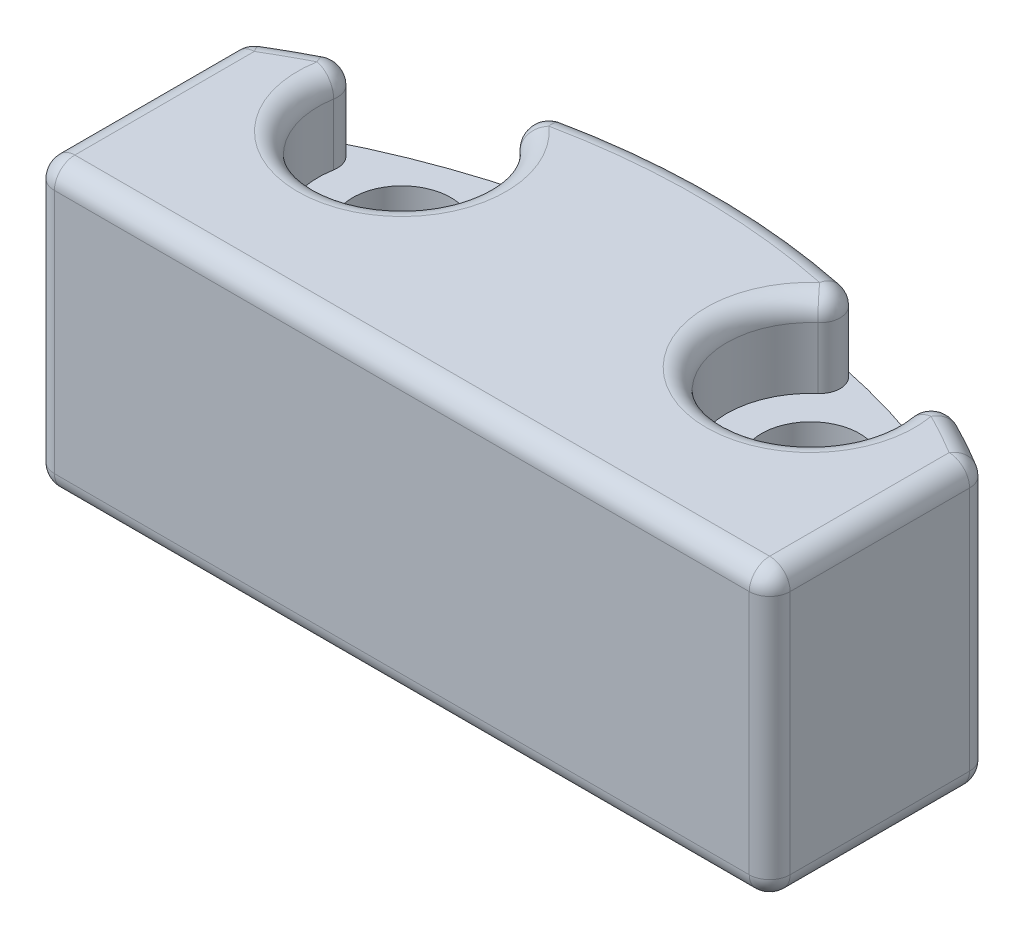
ISO-10303-21;
HEADER;
FILE_DESCRIPTION(('STEP AP214'),'2;1');
FILE_NAME('part.step','',(''),(''),'','','');
FILE_SCHEMA(('AUTOMOTIVE_DESIGN { 1 0 10303 214 1 1 1 1 }'));
ENDSEC;
DATA;
#1=APPLICATION_CONTEXT('core data for automotive mechanical design processes');
#2=APPLICATION_PROTOCOL_DEFINITION('international standard','automotive_design',2000,#1);
#3=PRODUCT_CONTEXT('',#1,'mechanical');
#4=PRODUCT('Part','Part','',(#3));
#5=PRODUCT_RELATED_PRODUCT_CATEGORY('part','',(#4));
#6=PRODUCT_DEFINITION_FORMATION('','',#4);
#7=PRODUCT_DEFINITION_CONTEXT('part definition',#1,'design');
#8=PRODUCT_DEFINITION('design','',#6,#7);
#9=PRODUCT_DEFINITION_SHAPE('','',#8);
#10=(LENGTH_UNIT() NAMED_UNIT(*) SI_UNIT(.MILLI.,.METRE.));
#11=(NAMED_UNIT(*) PLANE_ANGLE_UNIT() SI_UNIT($,.RADIAN.));
#12=(NAMED_UNIT(*) SI_UNIT($,.STERADIAN.) SOLID_ANGLE_UNIT());
#13=UNCERTAINTY_MEASURE_WITH_UNIT(LENGTH_MEASURE(1.E-05),#10,'distance_accuracy_value','');
#14=(GEOMETRIC_REPRESENTATION_CONTEXT(3) GLOBAL_UNCERTAINTY_ASSIGNED_CONTEXT((#13)) GLOBAL_UNIT_ASSIGNED_CONTEXT((#10,
#11,#12)) REPRESENTATION_CONTEXT('',''));
#15=CARTESIAN_POINT('',(0.,0.,0.));
#16=DIRECTION('',(0.,0.,1.));
#17=DIRECTION('',(1.,0.,0.));
#18=AXIS2_PLACEMENT_3D('',#15,#16,#17);
#19=CARTESIAN_POINT('',(4.,7.,0.17));
#20=DIRECTION('',(0.,-1.,0.));
#21=DIRECTION('',(0.,0.,-1.));
#22=AXIS2_PLACEMENT_3D('',#19,#20,#21);
#23=CYLINDRICAL_SURFACE('',#22,1.2);
#24=CARTESIAN_POINT('',(4.,0.,0.17));
#25=DIRECTION('',(0.,1.,0.));
#26=DIRECTION('',(0.,0.,1.));
#27=AXIS2_PLACEMENT_3D('',#24,#25,#26);
#28=CIRCLE('',#27,1.2);
#29=CARTESIAN_POINT('',(4.,0.,1.37));
#30=VERTEX_POINT('',#29);
#31=EDGE_CURVE('E237',#30,#30,#28,.T.);
#32=ORIENTED_EDGE('',*,*,#31,.F.);
#33=EDGE_LOOP('',(#32));
#34=FACE_BOUND('',#33,.T.);
#35=CARTESIAN_POINT('',(4.,5.,0.17));
#36=DIRECTION('',(0.,1.,0.));
#37=DIRECTION('',(0.,0.,1.));
#38=AXIS2_PLACEMENT_3D('',#35,#36,#37);
#39=CIRCLE('',#38,1.2);
#40=CARTESIAN_POINT('',(4.,5.,1.37));
#41=VERTEX_POINT('',#40);
#42=EDGE_CURVE('E244',#41,#41,#39,.T.);
#43=ORIENTED_EDGE('',*,*,#42,.T.);
#44=EDGE_LOOP('',(#43));
#45=FACE_BOUND('',#44,.T.);
#46=ADVANCED_FACE('F45',(#34,#45),#23,.F.);
#47=CARTESIAN_POINT('',(14.,7.,0.17));
#48=DIRECTION('',(0.,-1.,0.));
#49=DIRECTION('',(0.,0.,-1.));
#50=AXIS2_PLACEMENT_3D('',#47,#48,#49);
#51=CYLINDRICAL_SURFACE('',#50,1.2);
#52=CARTESIAN_POINT('',(14.,0.,0.17));
#53=DIRECTION('',(0.,1.,0.));
#54=DIRECTION('',(0.,0.,1.));
#55=AXIS2_PLACEMENT_3D('',#52,#53,#54);
#56=CIRCLE('',#55,1.2);
#57=CARTESIAN_POINT('',(14.,0.,1.37));
#58=VERTEX_POINT('',#57);
#59=EDGE_CURVE('E241',#58,#58,#56,.T.);
#60=ORIENTED_EDGE('',*,*,#59,.F.);
#61=EDGE_LOOP('',(#60));
#62=FACE_BOUND('',#61,.T.);
#63=CARTESIAN_POINT('',(14.,5.,0.17));
#64=DIRECTION('',(0.,1.,0.));
#65=DIRECTION('',(0.,0.,1.));
#66=AXIS2_PLACEMENT_3D('',#63,#64,#65);
#67=CIRCLE('',#66,1.2);
#68=CARTESIAN_POINT('',(14.,5.,1.37));
#69=VERTEX_POINT('',#68);
#70=EDGE_CURVE('E505',#69,#69,#67,.T.);
#71=ORIENTED_EDGE('',*,*,#70,.T.);
#72=EDGE_LOOP('',(#71));
#73=FACE_BOUND('',#72,.T.);
#74=ADVANCED_FACE('F520',(#62,#73),#51,.F.);
#75=CARTESIAN_POINT('',(9.,7.,14.422205101856));
#76=DIRECTION('',(0.,-1.,0.));
#77=DIRECTION('',(0.,0.,-1.));
#78=AXIS2_PLACEMENT_3D('',#75,#76,#77);
#79=PLANE('',#78);
#80=CARTESIAN_POINT('',(9.,7.,14.422205101856));
#81=DIRECTION('',(0.,-1.,0.));
#82=DIRECTION('',(0.,0.,-1.));
#83=AXIS2_PLACEMENT_3D('',#80,#81,#82);
#84=CIRCLE('',#83,16.5);
#85=CARTESIAN_POINT('',(17.5,7.,0.28006947812501));
#86=VERTEX_POINT('',#85);
#87=CARTESIAN_POINT('',(16.5119962868918,7.,-0.268605351816219));
#88=VERTEX_POINT('',#87);
#89=EDGE_CURVE('E349',#86,#88,#84,.F.);
#90=ORIENTED_EDGE('',*,*,#89,.T.);
#91=CARTESIAN_POINT('',(14.,7.,0.17));
#92=DIRECTION('',(0.,-1.,0.));
#93=DIRECTION('',(0.,0.,-1.));
#94=AXIS2_PLACEMENT_3D('',#91,#92,#93);
#95=CIRCLE('',#94,2.55);
#96=CARTESIAN_POINT('',(12.3125975096956,7.,-1.74185063112017));
#97=VERTEX_POINT('',#96);
#98=EDGE_CURVE('E352',#88,#97,#95,.T.);
#99=ORIENTED_EDGE('',*,*,#98,.T.);
#100=CARTESIAN_POINT('',(9.,7.,14.422205101856));
#101=DIRECTION('',(0.,-1.,0.));
#102=DIRECTION('',(0.,0.,-1.));
#103=AXIS2_PLACEMENT_3D('',#100,#101,#102);
#104=CIRCLE('',#103,16.5);
#105=CARTESIAN_POINT('',(5.68740249030438,7.,-1.74185063112017));
#106=VERTEX_POINT('',#105);
#107=EDGE_CURVE('E331',#97,#106,#104,.F.);
#108=ORIENTED_EDGE('',*,*,#107,.T.);
#109=CARTESIAN_POINT('',(4.,7.,0.17));
#110=DIRECTION('',(0.,-1.,0.));
#111=DIRECTION('',(0.,0.,-1.));
#112=AXIS2_PLACEMENT_3D('',#109,#110,#111);
#113=CIRCLE('',#112,2.55);
#114=CARTESIAN_POINT('',(1.4880037131082,7.,-0.268605351816222));
#115=VERTEX_POINT('',#114);
#116=EDGE_CURVE('E334',#106,#115,#113,.T.);
#117=ORIENTED_EDGE('',*,*,#116,.T.);
#118=CARTESIAN_POINT('',(9.,7.,14.422205101856));
#119=DIRECTION('',(0.,-1.,0.));
#120=DIRECTION('',(0.,0.,-1.));
#121=AXIS2_PLACEMENT_3D('',#118,#119,#120);
#122=CIRCLE('',#121,16.5);
#123=CARTESIAN_POINT('',(0.5,7.,0.280069478125011));
#124=VERTEX_POINT('',#123);
#125=EDGE_CURVE('E337',#115,#124,#122,.F.);
#126=ORIENTED_EDGE('',*,*,#125,.T.);
#127=DIRECTION('',(0.,0.,1.));
#128=VECTOR('',#127,1.);
#129=CARTESIAN_POINT('',(0.499999999999992,7.,14.422205101856));
#130=LINE('',#129,#128);
#131=CARTESIAN_POINT('',(0.499999999999998,7.,4.67));
#132=VERTEX_POINT('',#131);
#133=EDGE_CURVE('E340',#124,#132,#130,.T.);
#134=ORIENTED_EDGE('',*,*,#133,.T.);
#135=DIRECTION('',(1.,0.,0.));
#136=VECTOR('',#135,1.);
#137=CARTESIAN_POINT('',(9.,7.,4.67));
#138=LINE('',#137,#136);
#139=CARTESIAN_POINT('',(17.5,7.,4.67));
#140=VERTEX_POINT('',#139);
#141=EDGE_CURVE('E343',#132,#140,#138,.T.);
#142=ORIENTED_EDGE('',*,*,#141,.T.);
#143=DIRECTION('',(0.,0.,-1.));
#144=VECTOR('',#143,1.);
#145=CARTESIAN_POINT('',(17.5,7.,14.422205101856));
#146=LINE('',#145,#144);
#147=EDGE_CURVE('E346',#140,#86,#146,.T.);
#148=ORIENTED_EDGE('',*,*,#147,.T.);
#149=EDGE_LOOP('',(#90,#99,#108,#117,#126,#134,#142,#148));
#150=FACE_BOUND('',#149,.T.);
#151=ADVANCED_FACE('F605',(#150),#79,.F.);
#152=CARTESIAN_POINT('',(9.,0.,14.422205101856));
#153=DIRECTION('',(0.,-1.,0.));
#154=DIRECTION('',(0.,0.,-1.));
#155=AXIS2_PLACEMENT_3D('',#152,#153,#154);
#156=PLANE('',#155);
#157=DIRECTION('',(0.,0.,-1.));
#158=VECTOR('',#157,1.);
#159=CARTESIAN_POINT('',(17.5,0.,5.17));
#160=LINE('',#159,#158);
#161=CARTESIAN_POINT('',(17.5,0.,0.28006947812501));
#162=VERTEX_POINT('',#161);
#163=CARTESIAN_POINT('',(17.5,0.,4.67));
#164=VERTEX_POINT('',#163);
#165=EDGE_CURVE('E288',#162,#164,#160,.F.);
#166=ORIENTED_EDGE('',*,*,#165,.T.);
#167=DIRECTION('',(1.,0.,0.));
#168=VECTOR('',#167,1.);
#169=CARTESIAN_POINT('',(0.,0.,4.67));
#170=LINE('',#169,#168);
#171=CARTESIAN_POINT('',(0.499999999999997,0.,4.67));
#172=VERTEX_POINT('',#171);
#173=EDGE_CURVE('E295',#164,#172,#170,.F.);
#174=ORIENTED_EDGE('',*,*,#173,.T.);
#175=DIRECTION('',(0.,0.,1.));
#176=VECTOR('',#175,1.);
#177=CARTESIAN_POINT('',(0.5,0.,0.));
#178=LINE('',#177,#176);
#179=CARTESIAN_POINT('',(0.500000000000002,0.,0.28006947812501));
#180=VERTEX_POINT('',#179);
#181=EDGE_CURVE('E291',#172,#180,#178,.F.);
#182=ORIENTED_EDGE('',*,*,#181,.T.);
#183=CARTESIAN_POINT('',(9.,0.,14.422205101856));
#184=DIRECTION('',(0.,-1.,0.));
#185=DIRECTION('',(0.,0.,-1.));
#186=AXIS2_PLACEMENT_3D('',#183,#184,#185);
#187=CIRCLE('',#186,16.5);
#188=EDGE_CURVE('E285',#180,#162,#187,.T.);
#189=ORIENTED_EDGE('',*,*,#188,.T.);
#190=EDGE_LOOP('',(#166,#174,#182,#189));
#191=FACE_BOUND('',#190,.T.);
#192=ORIENTED_EDGE('',*,*,#31,.T.);
#193=EDGE_LOOP('',(#192));
#194=FACE_BOUND('',#193,.T.);
#195=ORIENTED_EDGE('',*,*,#59,.T.);
#196=EDGE_LOOP('',(#195));
#197=FACE_BOUND('',#196,.T.);
#198=ADVANCED_FACE('F623',(#191,#194,#197),#156,.T.);
#199=CARTESIAN_POINT('',(18.,7.,0.));
#200=DIRECTION('',(-1.,0.,0.));
#201=DIRECTION('',(0.,0.,1.));
#202=AXIS2_PLACEMENT_3D('',#199,#200,#201);
#203=PLANE('',#202);
#204=DIRECTION('',(0.,0.,-1.));
#205=VECTOR('',#204,1.);
#206=CARTESIAN_POINT('',(18.,0.5,0.));
#207=LINE('',#206,#205);
#208=CARTESIAN_POINT('',(18.,0.5,4.67));
#209=VERTEX_POINT('',#208);
#210=CARTESIAN_POINT('',(18.,0.5,0.280069478125009));
#211=VERTEX_POINT('',#210);
#212=EDGE_CURVE('E304',#209,#211,#207,.T.);
#213=ORIENTED_EDGE('',*,*,#212,.T.);
#214=DIRECTION('',(0.,-1.,0.));
#215=VECTOR('',#214,1.);
#216=CARTESIAN_POINT('',(18.,7.,0.280069478125009));
#217=LINE('',#216,#215);
#218=CARTESIAN_POINT('',(18.,6.5,0.280069478125009));
#219=VERTEX_POINT('',#218);
#220=EDGE_CURVE('E307',#211,#219,#217,.F.);
#221=ORIENTED_EDGE('',*,*,#220,.T.);
#222=DIRECTION('',(0.,0.,-1.));
#223=VECTOR('',#222,1.);
#224=CARTESIAN_POINT('',(18.,6.5,0.));
#225=LINE('',#224,#223);
#226=CARTESIAN_POINT('',(18.,6.5,4.67));
#227=VERTEX_POINT('',#226);
#228=EDGE_CURVE('E298',#219,#227,#225,.F.);
#229=ORIENTED_EDGE('',*,*,#228,.T.);
#230=DIRECTION('',(0.,-1.,0.));
#231=VECTOR('',#230,1.);
#232=CARTESIAN_POINT('',(18.,7.,4.67));
#233=LINE('',#232,#231);
#234=EDGE_CURVE('E301',#227,#209,#233,.T.);
#235=ORIENTED_EDGE('',*,*,#234,.T.);
#236=EDGE_LOOP('',(#213,#221,#229,#235));
#237=FACE_BOUND('',#236,.T.);
#238=ADVANCED_FACE('F617',(#237),#203,.F.);
#239=CARTESIAN_POINT('',(9.,7.,14.422205101856));
#240=DIRECTION('',(0.,-1.,0.));
#241=DIRECTION('',(0.,0.,-1.));
#242=AXIS2_PLACEMENT_3D('',#239,#240,#241);
#243=CYLINDRICAL_SURFACE('',#242,17.);
#244=CARTESIAN_POINT('',(9.,5.,14.422205101856));
#245=DIRECTION('',(0.,1.,0.));
#246=DIRECTION('',(0.,0.,1.));
#247=AXIS2_PLACEMENT_3D('',#244,#245,#246);
#248=CIRCLE('',#247,17.);
#249=CARTESIAN_POINT('',(5.58702074758633,5.,-2.23167050181641));
#250=VERTEX_POINT('',#249);
#251=CARTESIAN_POINT('',(1.26036746199027,5.,-0.713781426169923));
#252=VERTEX_POINT('',#251);
#253=EDGE_CURVE('E511',#250,#252,#248,.T.);
#254=ORIENTED_EDGE('',*,*,#253,.F.);
#255=DIRECTION('',(0.,-1.,0.));
#256=VECTOR('',#255,1.);
#257=CARTESIAN_POINT('',(5.58702074758633,7.,-2.23167050181642));
#258=LINE('',#257,#256);
#259=CARTESIAN_POINT('',(5.58702074758633,6.5,-2.23167050181641));
#260=VERTEX_POINT('',#259);
#261=EDGE_CURVE('E282',#250,#260,#258,.F.);
#262=ORIENTED_EDGE('',*,*,#261,.T.);
#263=CARTESIAN_POINT('',(9.,6.5,14.422205101856));
#264=DIRECTION('',(0.,-1.,0.));
#265=DIRECTION('',(0.,0.,-1.));
#266=AXIS2_PLACEMENT_3D('',#263,#264,#265);
#267=CIRCLE('',#266,17.);
#268=CARTESIAN_POINT('',(12.4129792524137,6.5,-2.23167050181641));
#269=VERTEX_POINT('',#268);
#270=EDGE_CURVE('E279',#260,#269,#267,.T.);
#271=ORIENTED_EDGE('',*,*,#270,.T.);
#272=DIRECTION('',(0.,-1.,0.));
#273=VECTOR('',#272,1.);
#274=CARTESIAN_POINT('',(12.4129792524137,7.,-2.23167050181642));
#275=LINE('',#274,#273);
#276=CARTESIAN_POINT('',(12.4129792524137,5.,-2.23167050181641));
#277=VERTEX_POINT('',#276);
#278=EDGE_CURVE('E275',#269,#277,#275,.T.);
#279=ORIENTED_EDGE('',*,*,#278,.T.);
#280=CARTESIAN_POINT('',(9.,5.,14.422205101856));
#281=DIRECTION('',(0.,1.,0.));
#282=DIRECTION('',(0.,0.,1.));
#283=AXIS2_PLACEMENT_3D('',#280,#281,#282);
#284=CIRCLE('',#283,17.);
#285=CARTESIAN_POINT('',(16.7396325380097,5.,-0.713781426169922));
#286=VERTEX_POINT('',#285);
#287=EDGE_CURVE('E508',#286,#277,#284,.T.);
#288=ORIENTED_EDGE('',*,*,#287,.F.);
#289=DIRECTION('',(0.,-1.,0.));
#290=VECTOR('',#289,1.);
#291=CARTESIAN_POINT('',(16.7396325380097,7.,-0.713781426169922));
#292=LINE('',#291,#290);
#293=CARTESIAN_POINT('',(16.7396325380097,6.5,-0.713781426169921));
#294=VERTEX_POINT('',#293);
#295=EDGE_CURVE('E268',#286,#294,#292,.F.);
#296=ORIENTED_EDGE('',*,*,#295,.T.);
#297=CARTESIAN_POINT('',(9.,6.5,14.422205101856));
#298=DIRECTION('',(0.,-1.,0.));
#299=DIRECTION('',(0.,0.,-1.));
#300=AXIS2_PLACEMENT_3D('',#297,#298,#299);
#301=CIRCLE('',#300,17.);
#302=CARTESIAN_POINT('',(17.7575757575758,6.5,-0.148480086230474));
#303=VERTEX_POINT('',#302);
#304=EDGE_CURVE('E265',#294,#303,#301,.T.);
#305=ORIENTED_EDGE('',*,*,#304,.T.);
#306=DIRECTION('',(0.,-1.,0.));
#307=VECTOR('',#306,1.);
#308=CARTESIAN_POINT('',(17.7575757575758,7.,-0.148480086230474));
#309=LINE('',#308,#307);
#310=CARTESIAN_POINT('',(17.7575757575758,0.5,-0.148480086230474));
#311=VERTEX_POINT('',#310);
#312=EDGE_CURVE('E255',#303,#311,#309,.T.);
#313=ORIENTED_EDGE('',*,*,#312,.T.);
#314=CARTESIAN_POINT('',(9.,0.5,14.422205101856));
#315=DIRECTION('',(0.,-1.,0.));
#316=DIRECTION('',(0.,0.,-1.));
#317=AXIS2_PLACEMENT_3D('',#314,#315,#316);
#318=CIRCLE('',#317,17.);
#319=CARTESIAN_POINT('',(0.242424242424243,0.5,-0.148480086230474));
#320=VERTEX_POINT('',#319);
#321=EDGE_CURVE('E252',#311,#320,#318,.F.);
#322=ORIENTED_EDGE('',*,*,#321,.T.);
#323=DIRECTION('',(0.,-1.,0.));
#324=VECTOR('',#323,1.);
#325=CARTESIAN_POINT('',(0.242424242424244,7.,-0.148480086230474));
#326=LINE('',#325,#324);
#327=CARTESIAN_POINT('',(0.242424242424243,6.5,-0.148480086230474));
#328=VERTEX_POINT('',#327);
#329=EDGE_CURVE('E258',#320,#328,#326,.F.);
#330=ORIENTED_EDGE('',*,*,#329,.T.);
#331=CARTESIAN_POINT('',(9.,6.5,14.422205101856));
#332=DIRECTION('',(0.,-1.,0.));
#333=DIRECTION('',(0.,0.,-1.));
#334=AXIS2_PLACEMENT_3D('',#331,#332,#333);
#335=CIRCLE('',#334,17.);
#336=CARTESIAN_POINT('',(1.26036746199027,6.5,-0.713781426169922));
#337=VERTEX_POINT('',#336);
#338=EDGE_CURVE('E262',#328,#337,#335,.T.);
#339=ORIENTED_EDGE('',*,*,#338,.T.);
#340=DIRECTION('',(0.,-1.,0.));
#341=VECTOR('',#340,1.);
#342=CARTESIAN_POINT('',(1.26036746199027,7.,-0.713781426169922));
#343=LINE('',#342,#341);
#344=EDGE_CURVE('E271',#337,#252,#343,.T.);
#345=ORIENTED_EDGE('',*,*,#344,.T.);
#346=EDGE_LOOP('',(#254,#262,#271,#279,#288,#296,#305,#313,#322,#330,#339,#345));
#347=FACE_BOUND('',#346,.T.);
#348=ADVANCED_FACE('F531',(#347),#243,.T.);
#349=CARTESIAN_POINT('',(0.,7.,0.));
#350=DIRECTION('',(1.,0.,0.));
#351=DIRECTION('',(0.,0.,-1.));
#352=AXIS2_PLACEMENT_3D('',#349,#350,#351);
#353=PLANE('',#352);
#354=DIRECTION('',(0.,0.,1.));
#355=VECTOR('',#354,1.);
#356=CARTESIAN_POINT('',(0.,6.5,0.));
#357=LINE('',#356,#355);
#358=CARTESIAN_POINT('',(0.,6.5,4.67));
#359=VERTEX_POINT('',#358);
#360=CARTESIAN_POINT('',(0.,6.5,0.280069478125009));
#361=VERTEX_POINT('',#360);
#362=EDGE_CURVE('E200',#359,#361,#357,.F.);
#363=ORIENTED_EDGE('',*,*,#362,.T.);
#364=DIRECTION('',(0.,-1.,0.));
#365=VECTOR('',#364,1.);
#366=CARTESIAN_POINT('',(0.,7.,0.280069478125009));
#367=LINE('',#366,#365);
#368=CARTESIAN_POINT('',(0.,0.5,0.280069478125009));
#369=VERTEX_POINT('',#368);
#370=EDGE_CURVE('E249',#361,#369,#367,.T.);
#371=ORIENTED_EDGE('',*,*,#370,.T.);
#372=DIRECTION('',(0.,0.,1.));
#373=VECTOR('',#372,1.);
#374=CARTESIAN_POINT('',(0.,0.5,5.17));
#375=LINE('',#374,#373);
#376=CARTESIAN_POINT('',(0.,0.5,4.67));
#377=VERTEX_POINT('',#376);
#378=EDGE_CURVE('E203',#369,#377,#375,.T.);
#379=ORIENTED_EDGE('',*,*,#378,.T.);
#380=DIRECTION('',(0.,-1.,0.));
#381=VECTOR('',#380,1.);
#382=CARTESIAN_POINT('',(0.,7.,4.67));
#383=LINE('',#382,#381);
#384=EDGE_CURVE('E195',#377,#359,#383,.F.);
#385=ORIENTED_EDGE('',*,*,#384,.T.);
#386=EDGE_LOOP('',(#363,#371,#379,#385));
#387=FACE_BOUND('',#386,.T.);
#388=ADVANCED_FACE('F197',(#387),#353,.F.);
#389=CARTESIAN_POINT('',(0.,7.,5.17));
#390=DIRECTION('',(0.,0.,-1.));
#391=DIRECTION('',(-1.,0.,0.));
#392=AXIS2_PLACEMENT_3D('',#389,#390,#391);
#393=PLANE('',#392);
#394=DIRECTION('',(0.,-1.,0.));
#395=VECTOR('',#394,1.);
#396=CARTESIAN_POINT('',(0.499999999999997,7.,5.17));
#397=LINE('',#396,#395);
#398=CARTESIAN_POINT('',(0.499999999999997,6.5,5.17));
#399=VERTEX_POINT('',#398);
#400=CARTESIAN_POINT('',(0.499999999999997,0.5,5.17));
#401=VERTEX_POINT('',#400);
#402=EDGE_CURVE('E215',#399,#401,#397,.T.);
#403=ORIENTED_EDGE('',*,*,#402,.T.);
#404=DIRECTION('',(1.,0.,0.));
#405=VECTOR('',#404,1.);
#406=CARTESIAN_POINT('',(18.,0.5,5.17));
#407=LINE('',#406,#405);
#408=CARTESIAN_POINT('',(17.5,0.5,5.17));
#409=VERTEX_POINT('',#408);
#410=EDGE_CURVE('E319',#401,#409,#407,.T.);
#411=ORIENTED_EDGE('',*,*,#410,.T.);
#412=DIRECTION('',(0.,-1.,0.));
#413=VECTOR('',#412,1.);
#414=CARTESIAN_POINT('',(17.5,7.,5.17));
#415=LINE('',#414,#413);
#416=CARTESIAN_POINT('',(17.5,6.5,5.17));
#417=VERTEX_POINT('',#416);
#418=EDGE_CURVE('E314',#409,#417,#415,.F.);
#419=ORIENTED_EDGE('',*,*,#418,.T.);
#420=DIRECTION('',(1.,0.,0.));
#421=VECTOR('',#420,1.);
#422=CARTESIAN_POINT('',(0.,6.5,5.17));
#423=LINE('',#422,#421);
#424=EDGE_CURVE('E311',#417,#399,#423,.F.);
#425=ORIENTED_EDGE('',*,*,#424,.T.);
#426=EDGE_LOOP('',(#403,#411,#419,#425));
#427=FACE_BOUND('',#426,.T.);
#428=ADVANCED_FACE('F596',(#427),#393,.F.);
#429=CARTESIAN_POINT('',(14.,5.,0.17));
#430=DIRECTION('',(0.,1.,0.));
#431=DIRECTION('',(0.,0.,1.));
#432=AXIS2_PLACEMENT_3D('',#429,#430,#431);
#433=CYLINDRICAL_SURFACE('',#432,2.05);
#434=CARTESIAN_POINT('',(14.,5.,0.17));
#435=DIRECTION('',(0.,1.,0.));
#436=DIRECTION('',(0.,0.,1.));
#437=AXIS2_PLACEMENT_3D('',#434,#435,#436);
#438=CIRCLE('',#437,2.05);
#439=CARTESIAN_POINT('',(12.6434607430886,5.,-1.3669779583515));
#440=VERTEX_POINT('',#439);
#441=CARTESIAN_POINT('',(16.0194479953444,5.,-0.18260430244049));
#442=VERTEX_POINT('',#441);
#443=EDGE_CURVE('E494',#440,#442,#438,.T.);
#444=ORIENTED_EDGE('',*,*,#443,.F.);
#445=DIRECTION('',(0.,1.,0.));
#446=VECTOR('',#445,1.);
#447=CARTESIAN_POINT('',(12.6434607430886,5.,-1.3669779583515));
#448=LINE('',#447,#446);
#449=CARTESIAN_POINT('',(12.6434607430886,6.5,-1.3669779583515));
#450=VERTEX_POINT('',#449);
#451=EDGE_CURVE('E328',#440,#450,#448,.T.);
#452=ORIENTED_EDGE('',*,*,#451,.T.);
#453=CARTESIAN_POINT('',(14.,6.5,0.17));
#454=DIRECTION('',(0.,-1.,0.));
#455=DIRECTION('',(0.,0.,-1.));
#456=AXIS2_PLACEMENT_3D('',#453,#454,#455);
#457=CIRCLE('',#456,2.05);
#458=CARTESIAN_POINT('',(16.0194479953444,6.5,-0.18260430244049));
#459=VERTEX_POINT('',#458);
#460=EDGE_CURVE('E325',#450,#459,#457,.F.);
#461=ORIENTED_EDGE('',*,*,#460,.T.);
#462=DIRECTION('',(0.,1.,0.));
#463=VECTOR('',#462,1.);
#464=CARTESIAN_POINT('',(16.0194479953444,5.,-0.18260430244049));
#465=LINE('',#464,#463);
#466=EDGE_CURVE('E322',#459,#442,#465,.F.);
#467=ORIENTED_EDGE('',*,*,#466,.T.);
#468=EDGE_LOOP('',(#444,#452,#461,#467));
#469=FACE_BOUND('',#468,.T.);
#470=ADVANCED_FACE('F525',(#469),#433,.F.);
#471=CARTESIAN_POINT('',(14.,5.,0.17));
#472=DIRECTION('',(0.,1.,0.));
#473=DIRECTION('',(0.,0.,1.));
#474=AXIS2_PLACEMENT_3D('',#471,#472,#473);
#475=PLANE('',#474);
#476=ORIENTED_EDGE('',*,*,#70,.F.);
#477=EDGE_LOOP('',(#476));
#478=FACE_BOUND('',#477,.T.);
#479=ORIENTED_EDGE('',*,*,#287,.T.);
#480=CARTESIAN_POINT('',(12.3125975096956,5.,-1.74185063112017));
#481=DIRECTION('',(0.,1.,0.));
#482=DIRECTION('',(0.,0.,1.));
#483=AXIS2_PLACEMENT_3D('',#480,#481,#482);
#484=CIRCLE('',#483,0.5);
#485=EDGE_CURVE('E55',#277,#440,#484,.F.);
#486=ORIENTED_EDGE('',*,*,#485,.T.);
#487=ORIENTED_EDGE('',*,*,#443,.T.);
#488=CARTESIAN_POINT('',(16.5119962868918,5.,-0.26860535181622));
#489=DIRECTION('',(0.,1.,0.));
#490=DIRECTION('',(0.,0.,1.));
#491=AXIS2_PLACEMENT_3D('',#488,#489,#490);
#492=CIRCLE('',#491,0.5);
#493=EDGE_CURVE('E11',#442,#286,#492,.F.);
#494=ORIENTED_EDGE('',*,*,#493,.T.);
#495=EDGE_LOOP('',(#479,#486,#487,#494));
#496=FACE_BOUND('',#495,.T.);
#497=ADVANCED_FACE('F522',(#478,#496),#475,.T.);
#498=CARTESIAN_POINT('',(4.,5.,0.17));
#499=DIRECTION('',(0.,1.,0.));
#500=DIRECTION('',(0.,0.,1.));
#501=AXIS2_PLACEMENT_3D('',#498,#499,#500);
#502=CYLINDRICAL_SURFACE('',#501,2.05);
#503=CARTESIAN_POINT('',(4.,6.5,0.17));
#504=DIRECTION('',(0.,-1.,0.));
#505=DIRECTION('',(0.,0.,-1.));
#506=AXIS2_PLACEMENT_3D('',#503,#504,#505);
#507=CIRCLE('',#506,2.05);
#508=CARTESIAN_POINT('',(1.98055200465561,6.5,-0.18260430244049));
#509=VERTEX_POINT('',#508);
#510=CARTESIAN_POINT('',(5.35653925691137,6.5,-1.3669779583515));
#511=VERTEX_POINT('',#510);
#512=EDGE_CURVE('E63',#509,#511,#507,.F.);
#513=ORIENTED_EDGE('',*,*,#512,.T.);
#514=DIRECTION('',(0.,1.,0.));
#515=VECTOR('',#514,1.);
#516=CARTESIAN_POINT('',(5.35653925691137,5.,-1.3669779583515));
#517=LINE('',#516,#515);
#518=CARTESIAN_POINT('',(5.35653925691137,5.,-1.3669779583515));
#519=VERTEX_POINT('',#518);
#520=EDGE_CURVE('E360',#511,#519,#517,.F.);
#521=ORIENTED_EDGE('',*,*,#520,.T.);
#522=CARTESIAN_POINT('',(4.,5.,0.17));
#523=DIRECTION('',(0.,1.,0.));
#524=DIRECTION('',(0.,0.,1.));
#525=AXIS2_PLACEMENT_3D('',#522,#523,#524);
#526=CIRCLE('',#525,2.05);
#527=CARTESIAN_POINT('',(1.98055200465561,5.,-0.18260430244049));
#528=VERTEX_POINT('',#527);
#529=EDGE_CURVE('E498',#528,#519,#526,.T.);
#530=ORIENTED_EDGE('',*,*,#529,.F.);
#531=DIRECTION('',(0.,1.,0.));
#532=VECTOR('',#531,1.);
#533=CARTESIAN_POINT('',(1.98055200465561,5.,-0.18260430244049));
#534=LINE('',#533,#532);
#535=EDGE_CURVE('E68',#528,#509,#534,.T.);
#536=ORIENTED_EDGE('',*,*,#535,.T.);
#537=EDGE_LOOP('',(#513,#521,#530,#536));
#538=FACE_BOUND('',#537,.T.);
#539=ADVANCED_FACE('F524',(#538),#502,.F.);
#540=CARTESIAN_POINT('',(4.,5.,0.17));
#541=DIRECTION('',(0.,1.,0.));
#542=DIRECTION('',(0.,0.,1.));
#543=AXIS2_PLACEMENT_3D('',#540,#541,#542);
#544=PLANE('',#543);
#545=ORIENTED_EDGE('',*,*,#42,.F.);
#546=EDGE_LOOP('',(#545));
#547=FACE_BOUND('',#546,.T.);
#548=ORIENTED_EDGE('',*,*,#253,.T.);
#549=CARTESIAN_POINT('',(1.4880037131082,5.,-0.26860535181622));
#550=DIRECTION('',(0.,1.,0.));
#551=DIRECTION('',(0.,0.,1.));
#552=AXIS2_PLACEMENT_3D('',#549,#550,#551);
#553=CIRCLE('',#552,0.5);
#554=EDGE_CURVE('E367',#252,#528,#553,.F.);
#555=ORIENTED_EDGE('',*,*,#554,.T.);
#556=ORIENTED_EDGE('',*,*,#529,.T.);
#557=CARTESIAN_POINT('',(5.68740249030438,5.,-1.74185063112017));
#558=DIRECTION('',(0.,1.,0.));
#559=DIRECTION('',(0.,0.,1.));
#560=AXIS2_PLACEMENT_3D('',#557,#558,#559);
#561=CIRCLE('',#560,0.5);
#562=EDGE_CURVE('E363',#519,#250,#561,.F.);
#563=ORIENTED_EDGE('',*,*,#562,.T.);
#564=EDGE_LOOP('',(#548,#555,#556,#563));
#565=FACE_BOUND('',#564,.T.);
#566=ADVANCED_FACE('F732',(#547,#565),#544,.T.);
#567=CARTESIAN_POINT('',(12.3125975096956,5.,-1.74185063112017));
#568=DIRECTION('',(0.,1.,0.));
#569=DIRECTION('',(0.,0.,1.));
#570=AXIS2_PLACEMENT_3D('',#567,#568,#569);
#571=CYLINDRICAL_SURFACE('',#570,0.5);
#572=ORIENTED_EDGE('',*,*,#485,.F.);
#573=ORIENTED_EDGE('',*,*,#278,.F.);
#574=CARTESIAN_POINT('',(12.3125975096956,6.5,-1.74185063112016));
#575=DIRECTION('',(0.,1.,0.));
#576=DIRECTION('',(0.,0.,1.));
#577=AXIS2_PLACEMENT_3D('',#574,#575,#576);
#578=CIRCLE('',#577,0.5);
#579=EDGE_CURVE('E49',#450,#269,#578,.T.);
#580=ORIENTED_EDGE('',*,*,#579,.F.);
#581=ORIENTED_EDGE('',*,*,#451,.F.);
#582=EDGE_LOOP('',(#572,#573,#580,#581));
#583=FACE_BOUND('',#582,.T.);
#584=ADVANCED_FACE('F47',(#583),#571,.T.);
#585=CARTESIAN_POINT('',(14.,6.5,0.17));
#586=DIRECTION('',(0.,-1.,0.));
#587=DIRECTION('',(0.,0.,-1.));
#588=AXIS2_PLACEMENT_3D('',#585,#586,#587);
#589=TOROIDAL_SURFACE('',#588,2.55,0.5);
#590=CARTESIAN_POINT('',(16.5119962868918,6.5,-0.268605351816219));
#591=DIRECTION('',(-0.172002098751459,0.,-0.985096583094822));
#592=DIRECTION('',(-0.985096583094822,0.,0.172002098751459));
#593=AXIS2_PLACEMENT_3D('',#590,#591,#592);
#594=CIRCLE('',#593,0.5);
#595=EDGE_CURVE('E483',#459,#88,#594,.T.);
#596=ORIENTED_EDGE('',*,*,#595,.F.);
#597=ORIENTED_EDGE('',*,*,#460,.F.);
#598=CARTESIAN_POINT('',(12.3125975096956,6.5,-1.74185063112017));
#599=DIRECTION('',(0.749745345537323,0.,-0.661726466786027));
#600=DIRECTION('',(-0.661726466786027,0.,-0.749745345537323));
#601=AXIS2_PLACEMENT_3D('',#598,#599,#600);
#602=CIRCLE('',#601,0.5);
#603=EDGE_CURVE('E486',#97,#450,#602,.T.);
#604=ORIENTED_EDGE('',*,*,#603,.F.);
#605=ORIENTED_EDGE('',*,*,#98,.F.);
#606=EDGE_LOOP('',(#596,#597,#604,#605));
#607=FACE_BOUND('',#606,.T.);
#608=ADVANCED_FACE('F540',(#607),#589,.T.);
#609=CARTESIAN_POINT('',(16.5119962868918,5.,-0.26860535181622));
#610=DIRECTION('',(0.,-1.,0.));
#611=DIRECTION('',(0.,0.,-1.));
#612=AXIS2_PLACEMENT_3D('',#609,#610,#611);
#613=CYLINDRICAL_SURFACE('',#612,0.5);
#614=ORIENTED_EDGE('',*,*,#493,.F.);
#615=ORIENTED_EDGE('',*,*,#466,.F.);
#616=CARTESIAN_POINT('',(16.5119962868918,6.5,-0.268605351816218));
#617=DIRECTION('',(0.,1.,0.));
#618=DIRECTION('',(0.,0.,1.));
#619=AXIS2_PLACEMENT_3D('',#616,#617,#618);
#620=CIRCLE('',#619,0.5);
#621=EDGE_CURVE('E479',#294,#459,#620,.T.);
#622=ORIENTED_EDGE('',*,*,#621,.F.);
#623=ORIENTED_EDGE('',*,*,#295,.F.);
#624=EDGE_LOOP('',(#614,#615,#622,#623));
#625=FACE_BOUND('',#624,.T.);
#626=ADVANCED_FACE('F548',(#625),#613,.T.);
#627=CARTESIAN_POINT('',(12.3125975096956,6.5,-1.74185063112017));
#628=DIRECTION('',(0.,1.,0.));
#629=DIRECTION('',(-1.,0.,0.));
#630=AXIS2_PLACEMENT_3D('',#627,#628,#629);
#631=SPHERICAL_SURFACE('',#630,0.5);
#632=ORIENTED_EDGE('',*,*,#603,.T.);
#633=ORIENTED_EDGE('',*,*,#579,.T.);
#634=CARTESIAN_POINT('',(12.3125975096956,6.5,-1.74185063112017));
#635=DIRECTION('',(0.979639741392493,0.,0.200763485436097));
#636=DIRECTION('',(0.200763485436097,0.,-0.979639741392493));
#637=AXIS2_PLACEMENT_3D('',#634,#635,#636);
#638=CIRCLE('',#637,0.5);
#639=EDGE_CURVE('E475',#97,#269,#638,.F.);
#640=ORIENTED_EDGE('',*,*,#639,.F.);
#641=EDGE_LOOP('',(#632,#633,#640));
#642=FACE_BOUND('',#641,.T.);
#643=ADVANCED_FACE('F724',(#642),#631,.T.);
#644=CARTESIAN_POINT('',(16.5119962868918,6.5,-0.268605351816221));
#645=DIRECTION('',(0.,1.,0.));
#646=DIRECTION('',(0.,0.,1.));
#647=AXIS2_PLACEMENT_3D('',#644,#645,#646);
#648=SPHERICAL_SURFACE('',#647,0.5);
#649=ORIENTED_EDGE('',*,*,#621,.T.);
#650=ORIENTED_EDGE('',*,*,#595,.T.);
#651=CARTESIAN_POINT('',(16.5119962868918,6.5,-0.268605351816219));
#652=DIRECTION('',(-0.890352148707403,0.,-0.45527250223587));
#653=DIRECTION('',(-0.45527250223587,0.,0.890352148707403));
#654=AXIS2_PLACEMENT_3D('',#651,#652,#653);
#655=CIRCLE('',#654,0.5);
#656=EDGE_CURVE('E471',#294,#88,#655,.F.);
#657=ORIENTED_EDGE('',*,*,#656,.F.);
#658=EDGE_LOOP('',(#649,#650,#657));
#659=FACE_BOUND('',#658,.T.);
#660=ADVANCED_FACE('F545',(#659),#648,.T.);
#661=CARTESIAN_POINT('',(5.68740249030438,5.,-1.74185063112017));
#662=DIRECTION('',(0.,-1.,0.));
#663=DIRECTION('',(0.,0.,-1.));
#664=AXIS2_PLACEMENT_3D('',#661,#662,#663);
#665=CYLINDRICAL_SURFACE('',#664,0.5);
#666=ORIENTED_EDGE('',*,*,#562,.F.);
#667=ORIENTED_EDGE('',*,*,#520,.F.);
#668=CARTESIAN_POINT('',(5.68740249030438,6.5,-1.74185063112017));
#669=DIRECTION('',(0.,1.,0.));
#670=DIRECTION('',(0.,0.,1.));
#671=AXIS2_PLACEMENT_3D('',#668,#669,#670);
#672=CIRCLE('',#671,0.5);
#673=EDGE_CURVE('E467',#260,#511,#672,.T.);
#674=ORIENTED_EDGE('',*,*,#673,.F.);
#675=ORIENTED_EDGE('',*,*,#261,.F.);
#676=EDGE_LOOP('',(#666,#667,#674,#675));
#677=FACE_BOUND('',#676,.T.);
#678=ADVANCED_FACE('F715',(#677),#665,.T.);
#679=CARTESIAN_POINT('',(17.5,7.,4.67));
#680=DIRECTION('',(0.,-1.,0.));
#681=DIRECTION('',(0.,0.,-1.));
#682=AXIS2_PLACEMENT_3D('',#679,#680,#681);
#683=CYLINDRICAL_SURFACE('',#682,0.5);
#684=CARTESIAN_POINT('',(17.5,0.5,4.67));
#685=DIRECTION('',(0.,-1.,0.));
#686=DIRECTION('',(0.,0.,-1.));
#687=AXIS2_PLACEMENT_3D('',#684,#685,#686);
#688=CIRCLE('',#687,0.5);
#689=EDGE_CURVE('E451',#209,#409,#688,.T.);
#690=ORIENTED_EDGE('',*,*,#689,.F.);
#691=ORIENTED_EDGE('',*,*,#234,.F.);
#692=CARTESIAN_POINT('',(17.5,6.5,4.67));
#693=DIRECTION('',(0.,1.,0.));
#694=DIRECTION('',(0.,0.,1.));
#695=AXIS2_PLACEMENT_3D('',#692,#693,#694);
#696=CIRCLE('',#695,0.5);
#697=EDGE_CURVE('E455',#417,#227,#696,.T.);
#698=ORIENTED_EDGE('',*,*,#697,.F.);
#699=ORIENTED_EDGE('',*,*,#418,.F.);
#700=EDGE_LOOP('',(#690,#691,#698,#699));
#701=FACE_BOUND('',#700,.T.);
#702=ADVANCED_FACE('F614',(#701),#683,.T.);
#703=CARTESIAN_POINT('',(9.,6.5,14.422205101856));
#704=DIRECTION('',(0.,-1.,0.));
#705=DIRECTION('',(0.,0.,-1.));
#706=AXIS2_PLACEMENT_3D('',#703,#704,#705);
#707=TOROIDAL_SURFACE('',#706,16.5,0.5);
#708=ORIENTED_EDGE('',*,*,#639,.T.);
#709=ORIENTED_EDGE('',*,*,#270,.F.);
#710=CARTESIAN_POINT('',(5.68740249030438,6.5,-1.74185063112017));
#711=DIRECTION('',(-0.979639741392494,0.,0.200763485436091));
#712=DIRECTION('',(0.200763485436091,0.,0.979639741392494));
#713=AXIS2_PLACEMENT_3D('',#710,#711,#712);
#714=CIRCLE('',#713,0.5);
#715=EDGE_CURVE('E463',#106,#260,#714,.T.);
#716=ORIENTED_EDGE('',*,*,#715,.F.);
#717=ORIENTED_EDGE('',*,*,#107,.F.);
#718=EDGE_LOOP('',(#708,#709,#716,#717));
#719=FACE_BOUND('',#718,.T.);
#720=ADVANCED_FACE('F712',(#719),#707,.T.);
#721=CARTESIAN_POINT('',(17.5,6.5,14.422205101856));
#722=DIRECTION('',(0.,0.,-1.));
#723=DIRECTION('',(-1.,0.,0.));
#724=AXIS2_PLACEMENT_3D('',#721,#722,#723);
#725=CYLINDRICAL_SURFACE('',#724,0.5);
#726=CARTESIAN_POINT('',(17.5,6.5,0.28006947812501));
#727=DIRECTION('',(0.,0.,-1.));
#728=DIRECTION('',(-1.,0.,0.));
#729=AXIS2_PLACEMENT_3D('',#726,#727,#728);
#730=CIRCLE('',#729,0.5);
#731=EDGE_CURVE('E447',#86,#219,#730,.T.);
#732=ORIENTED_EDGE('',*,*,#731,.F.);
#733=ORIENTED_EDGE('',*,*,#147,.F.);
#734=CARTESIAN_POINT('',(17.5,6.5,4.67));
#735=DIRECTION('',(0.,0.,1.));
#736=DIRECTION('',(1.,0.,0.));
#737=AXIS2_PLACEMENT_3D('',#734,#735,#736);
#738=CIRCLE('',#737,0.5);
#739=EDGE_CURVE('E459',#227,#140,#738,.T.);
#740=ORIENTED_EDGE('',*,*,#739,.F.);
#741=ORIENTED_EDGE('',*,*,#228,.F.);
#742=EDGE_LOOP('',(#732,#733,#740,#741));
#743=FACE_BOUND('',#742,.T.);
#744=ADVANCED_FACE('F608',(#743),#725,.T.);
#745=CARTESIAN_POINT('',(9.,6.5,14.422205101856));
#746=DIRECTION('',(0.,-1.,0.));
#747=DIRECTION('',(0.,0.,-1.));
#748=AXIS2_PLACEMENT_3D('',#745,#746,#747);
#749=TOROIDAL_SURFACE('',#748,16.5,0.5);
#750=ORIENTED_EDGE('',*,*,#656,.T.);
#751=ORIENTED_EDGE('',*,*,#89,.F.);
#752=CARTESIAN_POINT('',(17.5,6.5,0.28006947812501));
#753=DIRECTION('',(0.857099128710966,0.,0.515151515151517));
#754=DIRECTION('',(0.515151515151517,0.,-0.857099128710966));
#755=AXIS2_PLACEMENT_3D('',#752,#753,#754);
#756=CIRCLE('',#755,0.5);
#757=EDGE_CURVE('E443',#303,#86,#756,.T.);
#758=ORIENTED_EDGE('',*,*,#757,.F.);
#759=ORIENTED_EDGE('',*,*,#304,.F.);
#760=EDGE_LOOP('',(#750,#751,#758,#759));
#761=FACE_BOUND('',#760,.T.);
#762=ADVANCED_FACE('F555',(#761),#749,.T.);
#763=CARTESIAN_POINT('',(5.68740249030438,6.5,-1.74185063112017));
#764=DIRECTION('',(0.,1.,0.));
#765=DIRECTION('',(0.,0.,1.));
#766=AXIS2_PLACEMENT_3D('',#763,#764,#765);
#767=SPHERICAL_SURFACE('',#766,0.5);
#768=ORIENTED_EDGE('',*,*,#715,.T.);
#769=ORIENTED_EDGE('',*,*,#673,.T.);
#770=CARTESIAN_POINT('',(5.68740249030438,6.5,-1.74185063112016));
#771=DIRECTION('',(-0.74974534553732,0.,-0.661726466786032));
#772=DIRECTION('',(-0.661726466786032,0.,0.74974534553732));
#773=AXIS2_PLACEMENT_3D('',#770,#771,#772);
#774=CIRCLE('',#773,0.5);
#775=EDGE_CURVE('E439',#106,#511,#774,.F.);
#776=ORIENTED_EDGE('',*,*,#775,.F.);
#777=EDGE_LOOP('',(#768,#769,#776));
#778=FACE_BOUND('',#777,.T.);
#779=ADVANCED_FACE('F704',(#778),#767,.T.);
#780=CARTESIAN_POINT('',(17.5,6.5,4.67));
#781=DIRECTION('',(1.,0.,0.));
#782=DIRECTION('',(0.,0.,-1.));
#783=AXIS2_PLACEMENT_3D('',#780,#781,#782);
#784=SPHERICAL_SURFACE('',#783,0.5);
#785=ORIENTED_EDGE('',*,*,#697,.T.);
#786=ORIENTED_EDGE('',*,*,#739,.T.);
#787=CARTESIAN_POINT('',(17.5,6.5,4.67));
#788=DIRECTION('',(1.,0.,0.));
#789=DIRECTION('',(0.,0.,-1.));
#790=AXIS2_PLACEMENT_3D('',#787,#788,#789);
#791=CIRCLE('',#790,0.5);
#792=EDGE_CURVE('E435',#417,#140,#791,.F.);
#793=ORIENTED_EDGE('',*,*,#792,.F.);
#794=EDGE_LOOP('',(#785,#786,#793));
#795=FACE_BOUND('',#794,.T.);
#796=ADVANCED_FACE('F610',(#795),#784,.T.);
#797=CARTESIAN_POINT('',(17.5,0.5,4.67));
#798=DIRECTION('',(0.,0.,1.));
#799=DIRECTION('',(0.,-1.,0.));
#800=AXIS2_PLACEMENT_3D('',#797,#798,#799);
#801=SPHERICAL_SURFACE('',#800,0.5);
#802=CARTESIAN_POINT('',(17.5,0.5,4.67));
#803=DIRECTION('',(0.,0.,1.));
#804=DIRECTION('',(1.,0.,0.));
#805=AXIS2_PLACEMENT_3D('',#802,#803,#804);
#806=CIRCLE('',#805,0.5);
#807=EDGE_CURVE('E427',#209,#164,#806,.F.);
#808=ORIENTED_EDGE('',*,*,#807,.F.);
#809=ORIENTED_EDGE('',*,*,#689,.T.);
#810=CARTESIAN_POINT('',(17.5,0.5,4.67));
#811=DIRECTION('',(1.,0.,0.));
#812=DIRECTION('',(0.,0.,-1.));
#813=AXIS2_PLACEMENT_3D('',#810,#811,#812);
#814=CIRCLE('',#813,0.5);
#815=EDGE_CURVE('E431',#164,#409,#814,.F.);
#816=ORIENTED_EDGE('',*,*,#815,.F.);
#817=EDGE_LOOP('',(#808,#809,#816));
#818=FACE_BOUND('',#817,.T.);
#819=ADVANCED_FACE('F698',(#818),#801,.T.);
#820=CARTESIAN_POINT('',(17.5,6.5,0.280069478125009));
#821=DIRECTION('',(0.,1.,0.));
#822=DIRECTION('',(0.,0.,1.));
#823=AXIS2_PLACEMENT_3D('',#820,#821,#822);
#824=SPHERICAL_SURFACE('',#823,0.5);
#825=ORIENTED_EDGE('',*,*,#757,.T.);
#826=ORIENTED_EDGE('',*,*,#731,.T.);
#827=CARTESIAN_POINT('',(17.5,6.5,0.280069478125009));
#828=DIRECTION('',(0.,1.,0.));
#829=DIRECTION('',(0.,0.,1.));
#830=AXIS2_PLACEMENT_3D('',#827,#828,#829);
#831=CIRCLE('',#830,0.5);
#832=EDGE_CURVE('E424',#303,#219,#831,.F.);
#833=ORIENTED_EDGE('',*,*,#832,.F.);
#834=EDGE_LOOP('',(#825,#826,#833));
#835=FACE_BOUND('',#834,.T.);
#836=ADVANCED_FACE('F558',(#835),#824,.T.);
#837=CARTESIAN_POINT('',(1.4880037131082,5.,-0.26860535181622));
#838=DIRECTION('',(0.,1.,0.));
#839=DIRECTION('',(0.,0.,1.));
#840=AXIS2_PLACEMENT_3D('',#837,#838,#839);
#841=CYLINDRICAL_SURFACE('',#840,0.5);
#842=ORIENTED_EDGE('',*,*,#554,.F.);
#843=ORIENTED_EDGE('',*,*,#344,.F.);
#844=CARTESIAN_POINT('',(1.4880037131082,6.5,-0.268605351816219));
#845=DIRECTION('',(0.,1.,0.));
#846=DIRECTION('',(0.,0.,1.));
#847=AXIS2_PLACEMENT_3D('',#844,#845,#846);
#848=CIRCLE('',#847,0.5);
#849=EDGE_CURVE('E420',#509,#337,#848,.T.);
#850=ORIENTED_EDGE('',*,*,#849,.F.);
#851=ORIENTED_EDGE('',*,*,#535,.F.);
#852=EDGE_LOOP('',(#842,#843,#850,#851));
#853=FACE_BOUND('',#852,.T.);
#854=ADVANCED_FACE('F691',(#853),#841,.T.);
#855=CARTESIAN_POINT('',(4.,6.5,0.17));
#856=DIRECTION('',(0.,-1.,0.));
#857=DIRECTION('',(0.,0.,-1.));
#858=AXIS2_PLACEMENT_3D('',#855,#856,#857);
#859=TOROIDAL_SURFACE('',#858,2.55,0.5);
#860=ORIENTED_EDGE('',*,*,#775,.T.);
#861=ORIENTED_EDGE('',*,*,#512,.F.);
#862=CARTESIAN_POINT('',(1.4880037131082,6.5,-0.268605351816222));
#863=DIRECTION('',(0.172002098751464,0.,-0.985096583094821));
#864=DIRECTION('',(-0.985096583094821,0.,-0.172002098751464));
#865=AXIS2_PLACEMENT_3D('',#862,#863,#864);
#866=CIRCLE('',#865,0.5);
#867=EDGE_CURVE('E416',#115,#509,#866,.T.);
#868=ORIENTED_EDGE('',*,*,#867,.F.);
#869=ORIENTED_EDGE('',*,*,#116,.F.);
#870=EDGE_LOOP('',(#860,#861,#868,#869));
#871=FACE_BOUND('',#870,.T.);
#872=ADVANCED_FACE('F688',(#871),#859,.T.);
#873=CARTESIAN_POINT('',(9.,6.5,4.67));
#874=DIRECTION('',(1.,0.,0.));
#875=DIRECTION('',(0.,0.,-1.));
#876=AXIS2_PLACEMENT_3D('',#873,#874,#875);
#877=CYLINDRICAL_SURFACE('',#876,0.5);
#878=ORIENTED_EDGE('',*,*,#792,.T.);
#879=ORIENTED_EDGE('',*,*,#141,.F.);
#880=CARTESIAN_POINT('',(0.499999999999997,6.5,4.67));
#881=DIRECTION('',(-1.,0.,0.));
#882=DIRECTION('',(0.,-1.,0.));
#883=AXIS2_PLACEMENT_3D('',#880,#881,#882);
#884=CIRCLE('',#883,0.5);
#885=EDGE_CURVE('E220',#399,#132,#884,.T.);
#886=ORIENTED_EDGE('',*,*,#885,.F.);
#887=ORIENTED_EDGE('',*,*,#424,.F.);
#888=EDGE_LOOP('',(#878,#879,#886,#887));
#889=FACE_BOUND('',#888,.T.);
#890=ADVANCED_FACE('F600',(#889),#877,.T.);
#891=CARTESIAN_POINT('',(0.499999999999997,7.,4.67));
#892=DIRECTION('',(0.,-1.,0.));
#893=DIRECTION('',(0.,0.,-1.));
#894=AXIS2_PLACEMENT_3D('',#891,#892,#893);
#895=CYLINDRICAL_SURFACE('',#894,0.5);
#896=CARTESIAN_POINT('',(0.499999999999997,0.5,4.67));
#897=DIRECTION('',(0.,-1.,0.));
#898=DIRECTION('',(0.,0.,-1.));
#899=AXIS2_PLACEMENT_3D('',#896,#897,#898);
#900=CIRCLE('',#899,0.5);
#901=EDGE_CURVE('E221',#401,#377,#900,.T.);
#902=ORIENTED_EDGE('',*,*,#901,.F.);
#903=ORIENTED_EDGE('',*,*,#402,.F.);
#904=CARTESIAN_POINT('',(0.499999999999997,6.5,4.67));
#905=DIRECTION('',(0.,1.,0.));
#906=DIRECTION('',(0.,0.,1.));
#907=AXIS2_PLACEMENT_3D('',#904,#905,#906);
#908=CIRCLE('',#907,0.5);
#909=EDGE_CURVE('E211',#359,#399,#908,.T.);
#910=ORIENTED_EDGE('',*,*,#909,.F.);
#911=ORIENTED_EDGE('',*,*,#384,.F.);
#912=EDGE_LOOP('',(#902,#903,#910,#911));
#913=FACE_BOUND('',#912,.T.);
#914=ADVANCED_FACE('F213',(#913),#895,.T.);
#915=CARTESIAN_POINT('',(0.,0.5,4.67));
#916=DIRECTION('',(-1.,0.,0.));
#917=DIRECTION('',(0.,0.,1.));
#918=AXIS2_PLACEMENT_3D('',#915,#916,#917);
#919=CYLINDRICAL_SURFACE('',#918,0.5);
#920=ORIENTED_EDGE('',*,*,#815,.T.);
#921=ORIENTED_EDGE('',*,*,#410,.F.);
#922=CARTESIAN_POINT('',(0.499999999999997,0.5,4.67));
#923=DIRECTION('',(-1.,0.,0.));
#924=DIRECTION('',(0.,0.,1.));
#925=AXIS2_PLACEMENT_3D('',#922,#923,#924);
#926=CIRCLE('',#925,0.5);
#927=EDGE_CURVE('E409',#172,#401,#926,.T.);
#928=ORIENTED_EDGE('',*,*,#927,.F.);
#929=ORIENTED_EDGE('',*,*,#173,.F.);
#930=EDGE_LOOP('',(#920,#921,#928,#929));
#931=FACE_BOUND('',#930,.T.);
#932=ADVANCED_FACE('F591',(#931),#919,.T.);
#933=CARTESIAN_POINT('',(17.5,0.5,0.));
#934=DIRECTION('',(0.,0.,1.));
#935=DIRECTION('',(1.,0.,0.));
#936=AXIS2_PLACEMENT_3D('',#933,#934,#935);
#937=CYLINDRICAL_SURFACE('',#936,0.5);
#938=ORIENTED_EDGE('',*,*,#807,.T.);
#939=ORIENTED_EDGE('',*,*,#165,.F.);
#940=CARTESIAN_POINT('',(17.5,0.5,0.280069478125009));
#941=DIRECTION('',(0.,0.,-1.));
#942=DIRECTION('',(0.,1.,0.));
#943=AXIS2_PLACEMENT_3D('',#940,#941,#942);
#944=CIRCLE('',#943,0.5);
#945=EDGE_CURVE('E405',#211,#162,#944,.T.);
#946=ORIENTED_EDGE('',*,*,#945,.F.);
#947=ORIENTED_EDGE('',*,*,#212,.F.);
#948=EDGE_LOOP('',(#938,#939,#946,#947));
#949=FACE_BOUND('',#948,.T.);
#950=ADVANCED_FACE('F620',(#949),#937,.T.);
#951=CARTESIAN_POINT('',(17.5,7.,0.280069478125009));
#952=DIRECTION('',(0.,-1.,0.));
#953=DIRECTION('',(0.,0.,-1.));
#954=AXIS2_PLACEMENT_3D('',#951,#952,#953);
#955=CYLINDRICAL_SURFACE('',#954,0.5);
#956=ORIENTED_EDGE('',*,*,#832,.T.);
#957=ORIENTED_EDGE('',*,*,#220,.F.);
#958=CARTESIAN_POINT('',(17.5,0.5,0.28006947812501));
#959=DIRECTION('',(0.,-1.,0.));
#960=DIRECTION('',(0.,0.,-1.));
#961=AXIS2_PLACEMENT_3D('',#958,#959,#960);
#962=CIRCLE('',#961,0.5);
#963=EDGE_CURVE('E401',#311,#211,#962,.T.);
#964=ORIENTED_EDGE('',*,*,#963,.F.);
#965=ORIENTED_EDGE('',*,*,#312,.F.);
#966=EDGE_LOOP('',(#956,#957,#964,#965));
#967=FACE_BOUND('',#966,.T.);
#968=ADVANCED_FACE('F562',(#967),#955,.T.);
#969=CARTESIAN_POINT('',(1.4880037131082,6.5,-0.268605351816221));
#970=DIRECTION('',(0.,1.,0.));
#971=DIRECTION('',(0.,0.,1.));
#972=AXIS2_PLACEMENT_3D('',#969,#970,#971);
#973=SPHERICAL_SURFACE('',#972,0.5);
#974=ORIENTED_EDGE('',*,*,#867,.T.);
#975=ORIENTED_EDGE('',*,*,#849,.T.);
#976=CARTESIAN_POINT('',(1.4880037131082,6.5,-0.26860535181622));
#977=DIRECTION('',(0.890352148707405,0.,-0.455272502235867));
#978=DIRECTION('',(-0.455272502235867,0.,-0.890352148707405));
#979=AXIS2_PLACEMENT_3D('',#976,#977,#978);
#980=CIRCLE('',#979,0.5);
#981=EDGE_CURVE('E229',#115,#337,#980,.F.);
#982=ORIENTED_EDGE('',*,*,#981,.F.);
#983=EDGE_LOOP('',(#974,#975,#982));
#984=FACE_BOUND('',#983,.T.);
#985=ADVANCED_FACE('F674',(#984),#973,.T.);
#986=CARTESIAN_POINT('',(0.499999999999997,6.5,4.67));
#987=DIRECTION('',(0.,0.,1.));
#988=DIRECTION('',(1.,0.,0.));
#989=AXIS2_PLACEMENT_3D('',#986,#987,#988);
#990=SPHERICAL_SURFACE('',#989,0.5);
#991=ORIENTED_EDGE('',*,*,#909,.T.);
#992=ORIENTED_EDGE('',*,*,#885,.T.);
#993=CARTESIAN_POINT('',(0.499999999999998,6.5,4.67));
#994=DIRECTION('',(0.,0.,1.));
#995=DIRECTION('',(1.,0.,0.));
#996=AXIS2_PLACEMENT_3D('',#993,#994,#995);
#997=CIRCLE('',#996,0.5);
#998=EDGE_CURVE('E224',#359,#132,#997,.F.);
#999=ORIENTED_EDGE('',*,*,#998,.F.);
#1000=EDGE_LOOP('',(#991,#992,#999));
#1001=FACE_BOUND('',#1000,.T.);
#1002=ADVANCED_FACE('F225',(#1001),#990,.T.);
#1003=CARTESIAN_POINT('',(0.499999999999997,0.5,4.67));
#1004=DIRECTION('',(0.,0.,1.));
#1005=DIRECTION('',(0.,-1.,0.));
#1006=AXIS2_PLACEMENT_3D('',#1003,#1004,#1005);
#1007=SPHERICAL_SURFACE('',#1006,0.5);
#1008=ORIENTED_EDGE('',*,*,#927,.T.);
#1009=ORIENTED_EDGE('',*,*,#901,.T.);
#1010=CARTESIAN_POINT('',(0.499999999999997,0.5,4.67));
#1011=DIRECTION('',(0.,0.,1.));
#1012=DIRECTION('',(1.,0.,0.));
#1013=AXIS2_PLACEMENT_3D('',#1010,#1011,#1012);
#1014=CIRCLE('',#1013,0.5);
#1015=EDGE_CURVE('E230',#172,#377,#1014,.F.);
#1016=ORIENTED_EDGE('',*,*,#1015,.F.);
#1017=EDGE_LOOP('',(#1008,#1009,#1016));
#1018=FACE_BOUND('',#1017,.T.);
#1019=ADVANCED_FACE('F587',(#1018),#1007,.T.);
#1020=CARTESIAN_POINT('',(17.5,0.5,0.280069478125009));
#1021=DIRECTION('',(0.,-1.,0.));
#1022=DIRECTION('',(0.,0.,-1.));
#1023=AXIS2_PLACEMENT_3D('',#1020,#1021,#1022);
#1024=SPHERICAL_SURFACE('',#1023,0.5);
#1025=ORIENTED_EDGE('',*,*,#963,.T.);
#1026=ORIENTED_EDGE('',*,*,#945,.T.);
#1027=CARTESIAN_POINT('',(17.5,0.5,0.28006947812501));
#1028=DIRECTION('',(0.857099128710966,0.,0.515151515151517));
#1029=DIRECTION('',(0.515151515151517,0.,-0.857099128710966));
#1030=AXIS2_PLACEMENT_3D('',#1027,#1028,#1029);
#1031=CIRCLE('',#1030,0.5);
#1032=EDGE_CURVE('E391',#311,#162,#1031,.F.);
#1033=ORIENTED_EDGE('',*,*,#1032,.F.);
#1034=EDGE_LOOP('',(#1025,#1026,#1033));
#1035=FACE_BOUND('',#1034,.T.);
#1036=ADVANCED_FACE('F567',(#1035),#1024,.T.);
#1037=CARTESIAN_POINT('',(9.,6.5,14.422205101856));
#1038=DIRECTION('',(0.,-1.,0.));
#1039=DIRECTION('',(0.,0.,-1.));
#1040=AXIS2_PLACEMENT_3D('',#1037,#1038,#1039);
#1041=TOROIDAL_SURFACE('',#1040,16.5,0.5);
#1042=ORIENTED_EDGE('',*,*,#981,.T.);
#1043=ORIENTED_EDGE('',*,*,#338,.F.);
#1044=CARTESIAN_POINT('',(0.5,6.5,0.280069478125011));
#1045=DIRECTION('',(-0.857099128710968,0.,0.515151515151513));
#1046=DIRECTION('',(0.515151515151513,0.,0.857099128710968));
#1047=AXIS2_PLACEMENT_3D('',#1044,#1045,#1046);
#1048=CIRCLE('',#1047,0.5);
#1049=EDGE_CURVE('E387',#124,#328,#1048,.T.);
#1050=ORIENTED_EDGE('',*,*,#1049,.F.);
#1051=ORIENTED_EDGE('',*,*,#125,.F.);
#1052=EDGE_LOOP('',(#1042,#1043,#1050,#1051));
#1053=FACE_BOUND('',#1052,.T.);
#1054=ADVANCED_FACE('F664',(#1053),#1041,.T.);
#1055=CARTESIAN_POINT('',(0.499999999999992,6.5,14.422205101856));
#1056=DIRECTION('',(0.,0.,1.));
#1057=DIRECTION('',(1.,0.,0.));
#1058=AXIS2_PLACEMENT_3D('',#1055,#1056,#1057);
#1059=CYLINDRICAL_SURFACE('',#1058,0.5);
#1060=ORIENTED_EDGE('',*,*,#998,.T.);
#1061=ORIENTED_EDGE('',*,*,#133,.F.);
#1062=CARTESIAN_POINT('',(0.5,6.5,0.280069478125009));
#1063=DIRECTION('',(0.,0.,-1.));
#1064=DIRECTION('',(0.,1.,0.));
#1065=AXIS2_PLACEMENT_3D('',#1062,#1063,#1064);
#1066=CIRCLE('',#1065,0.5);
#1067=EDGE_CURVE('E234',#361,#124,#1066,.T.);
#1068=ORIENTED_EDGE('',*,*,#1067,.F.);
#1069=ORIENTED_EDGE('',*,*,#362,.F.);
#1070=EDGE_LOOP('',(#1060,#1061,#1068,#1069));
#1071=FACE_BOUND('',#1070,.T.);
#1072=ADVANCED_FACE('F232',(#1071),#1059,.T.);
#1073=CARTESIAN_POINT('',(0.5,0.5,0.));
#1074=DIRECTION('',(0.,0.,-1.));
#1075=DIRECTION('',(-1.,0.,0.));
#1076=AXIS2_PLACEMENT_3D('',#1073,#1074,#1075);
#1077=CYLINDRICAL_SURFACE('',#1076,0.5);
#1078=ORIENTED_EDGE('',*,*,#1015,.T.);
#1079=ORIENTED_EDGE('',*,*,#378,.F.);
#1080=CARTESIAN_POINT('',(0.5,0.5,0.280069478125007));
#1081=DIRECTION('',(0.,0.,-1.));
#1082=DIRECTION('',(-1.,0.,0.));
#1083=AXIS2_PLACEMENT_3D('',#1080,#1081,#1082);
#1084=CIRCLE('',#1083,0.5);
#1085=EDGE_CURVE('E381',#180,#369,#1084,.T.);
#1086=ORIENTED_EDGE('',*,*,#1085,.F.);
#1087=ORIENTED_EDGE('',*,*,#181,.F.);
#1088=EDGE_LOOP('',(#1078,#1079,#1086,#1087));
#1089=FACE_BOUND('',#1088,.T.);
#1090=ADVANCED_FACE('F584',(#1089),#1077,.T.);
#1091=CARTESIAN_POINT('',(9.,0.5,14.422205101856));
#1092=DIRECTION('',(0.,-1.,0.));
#1093=DIRECTION('',(0.,0.,-1.));
#1094=AXIS2_PLACEMENT_3D('',#1091,#1092,#1093);
#1095=TOROIDAL_SURFACE('',#1094,16.5,0.5);
#1096=ORIENTED_EDGE('',*,*,#1032,.T.);
#1097=ORIENTED_EDGE('',*,*,#188,.F.);
#1098=CARTESIAN_POINT('',(0.500000000000001,0.5,0.280069478125009));
#1099=DIRECTION('',(-0.857099128710967,0.,0.515151515151515));
#1100=DIRECTION('',(0.515151515151515,0.,0.857099128710967));
#1101=AXIS2_PLACEMENT_3D('',#1098,#1099,#1100);
#1102=CIRCLE('',#1101,0.5);
#1103=EDGE_CURVE('E378',#320,#180,#1102,.T.);
#1104=ORIENTED_EDGE('',*,*,#1103,.F.);
#1105=ORIENTED_EDGE('',*,*,#321,.F.);
#1106=EDGE_LOOP('',(#1096,#1097,#1104,#1105));
#1107=FACE_BOUND('',#1106,.T.);
#1108=ADVANCED_FACE('F571',(#1107),#1095,.T.);
#1109=CARTESIAN_POINT('',(0.5,6.5,0.28006947812501));
#1110=DIRECTION('',(0.,1.,0.));
#1111=DIRECTION('',(0.,0.,1.));
#1112=AXIS2_PLACEMENT_3D('',#1109,#1110,#1111);
#1113=SPHERICAL_SURFACE('',#1112,0.5);
#1114=ORIENTED_EDGE('',*,*,#1067,.T.);
#1115=ORIENTED_EDGE('',*,*,#1049,.T.);
#1116=CARTESIAN_POINT('',(0.500000000000001,6.5,0.280069478125009));
#1117=DIRECTION('',(0.,1.,0.));
#1118=DIRECTION('',(0.,0.,1.));
#1119=AXIS2_PLACEMENT_3D('',#1116,#1117,#1118);
#1120=CIRCLE('',#1119,0.5);
#1121=EDGE_CURVE('E375',#361,#328,#1120,.F.);
#1122=ORIENTED_EDGE('',*,*,#1121,.F.);
#1123=EDGE_LOOP('',(#1114,#1115,#1122));
#1124=FACE_BOUND('',#1123,.T.);
#1125=ADVANCED_FACE('F654',(#1124),#1113,.T.);
#1126=CARTESIAN_POINT('',(0.5,0.5,0.280069478125009));
#1127=DIRECTION('',(0.,-1.,0.));
#1128=DIRECTION('',(1.,0.,0.));
#1129=AXIS2_PLACEMENT_3D('',#1126,#1127,#1128);
#1130=SPHERICAL_SURFACE('',#1129,0.5);
#1131=ORIENTED_EDGE('',*,*,#1103,.T.);
#1132=ORIENTED_EDGE('',*,*,#1085,.T.);
#1133=CARTESIAN_POINT('',(0.5,0.5,0.280069478125009));
#1134=DIRECTION('',(0.,-1.,0.));
#1135=DIRECTION('',(0.,0.,-1.));
#1136=AXIS2_PLACEMENT_3D('',#1133,#1134,#1135);
#1137=CIRCLE('',#1136,0.5);
#1138=EDGE_CURVE('E372',#320,#369,#1137,.F.);
#1139=ORIENTED_EDGE('',*,*,#1138,.F.);
#1140=EDGE_LOOP('',(#1131,#1132,#1139));
#1141=FACE_BOUND('',#1140,.T.);
#1142=ADVANCED_FACE('F580',(#1141),#1130,.T.);
#1143=CARTESIAN_POINT('',(0.5,7.,0.280069478125009));
#1144=DIRECTION('',(0.,-1.,0.));
#1145=DIRECTION('',(0.,0.,-1.));
#1146=AXIS2_PLACEMENT_3D('',#1143,#1144,#1145);
#1147=CYLINDRICAL_SURFACE('',#1146,0.5);
#1148=ORIENTED_EDGE('',*,*,#1121,.T.);
#1149=ORIENTED_EDGE('',*,*,#329,.F.);
#1150=ORIENTED_EDGE('',*,*,#1138,.T.);
#1151=ORIENTED_EDGE('',*,*,#370,.F.);
#1152=EDGE_LOOP('',(#1148,#1149,#1150,#1151));
#1153=FACE_BOUND('',#1152,.T.);
#1154=ADVANCED_FACE('F577',(#1153),#1147,.T.);
#1155=CLOSED_SHELL('',(#46,#74,#151,#198,#238,#348,#388,#428,#470,#497,#539,#566,#584,#608,#626,
#643,#660,#678,#702,#720,#744,#762,#779,#796,#819,#836,#854,#872,#890,#914,#932,#950,#968,#985,
#1002,#1019,#1036,#1054,#1072,#1090,#1108,#1125,#1142,#1154));
#1156=MANIFOLD_SOLID_BREP('B2',#1155);
#1157=ADVANCED_BREP_SHAPE_REPRESENTATION('',(#18,#1156),#14);
#1158=SHAPE_DEFINITION_REPRESENTATION(#9,#1157);
ENDSEC;
END-ISO-10303-21;
